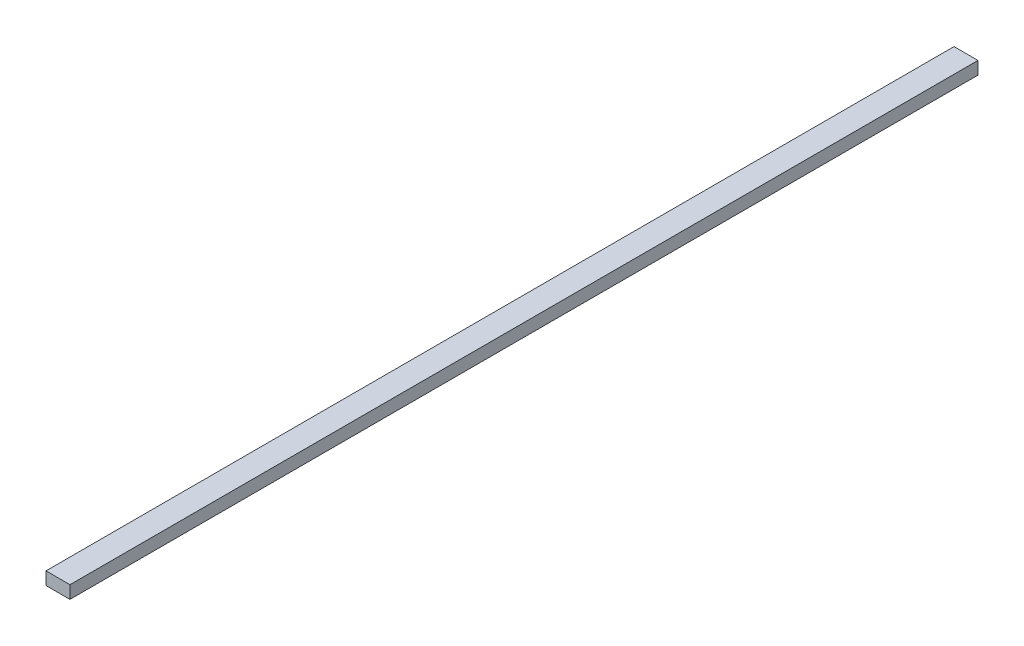
ISO-10303-21;
HEADER;
FILE_DESCRIPTION(('STEP AP214'),'2;1');
FILE_NAME('part.step','',(''),(''),'','','');
FILE_SCHEMA(('AUTOMOTIVE_DESIGN { 1 0 10303 214 1 1 1 1 }'));
ENDSEC;
DATA;
#1=APPLICATION_CONTEXT('core data for automotive mechanical design processes');
#2=APPLICATION_PROTOCOL_DEFINITION('international standard','automotive_design',2000,#1);
#3=PRODUCT_CONTEXT('',#1,'mechanical');
#4=PRODUCT('Part','Part','',(#3));
#5=PRODUCT_RELATED_PRODUCT_CATEGORY('part','',(#4));
#6=PRODUCT_DEFINITION_FORMATION('','',#4);
#7=PRODUCT_DEFINITION_CONTEXT('part definition',#1,'design');
#8=PRODUCT_DEFINITION('design','',#6,#7);
#9=PRODUCT_DEFINITION_SHAPE('','',#8);
#10=(LENGTH_UNIT() NAMED_UNIT(*) SI_UNIT(.MILLI.,.METRE.));
#11=(NAMED_UNIT(*) PLANE_ANGLE_UNIT() SI_UNIT($,.RADIAN.));
#12=(NAMED_UNIT(*) SI_UNIT($,.STERADIAN.) SOLID_ANGLE_UNIT());
#13=UNCERTAINTY_MEASURE_WITH_UNIT(LENGTH_MEASURE(1.E-05),#10,'distance_accuracy_value','');
#14=(GEOMETRIC_REPRESENTATION_CONTEXT(3) GLOBAL_UNCERTAINTY_ASSIGNED_CONTEXT((#13)) GLOBAL_UNIT_ASSIGNED_CONTEXT((#10,
#11,#12)) REPRESENTATION_CONTEXT('',''));
#15=CARTESIAN_POINT('',(0.,0.,0.));
#16=DIRECTION('',(0.,0.,1.));
#17=DIRECTION('',(1.,0.,0.));
#18=AXIS2_PLACEMENT_3D('',#15,#16,#17);
#19=CARTESIAN_POINT('',(-44.9531562575944,20.2474204131232,-234.95));
#20=DIRECTION('',(1.,0.,0.));
#21=DIRECTION('',(0.,0.,-1.));
#22=AXIS2_PLACEMENT_3D('',#19,#20,#21);
#23=PLANE('',#22);
#24=DIRECTION('',(0.,1.,0.));
#25=VECTOR('',#24,1.);
#26=CARTESIAN_POINT('',(-44.9531562575944,20.2474204131232,0.));
#27=LINE('',#26,#25);
#28=CARTESIAN_POINT('',(-44.9531562575944,20.2474204131232,0.));
#29=VERTEX_POINT('',#28);
#30=CARTESIAN_POINT('',(-44.9531562575944,23.5494204131232,0.));
#31=VERTEX_POINT('',#30);
#32=EDGE_CURVE('E83',#29,#31,#27,.T.);
#33=ORIENTED_EDGE('',*,*,#32,.F.);
#34=DIRECTION('',(0.,0.,1.));
#35=VECTOR('',#34,1.);
#36=CARTESIAN_POINT('',(-44.9531562575944,20.2474204131232,-234.95));
#37=LINE('',#36,#35);
#38=CARTESIAN_POINT('',(-44.9531562575944,20.2474204131232,-234.95));
#39=VERTEX_POINT('',#38);
#40=EDGE_CURVE('E32',#39,#29,#37,.T.);
#41=ORIENTED_EDGE('',*,*,#40,.F.);
#42=DIRECTION('',(0.,1.,0.));
#43=VECTOR('',#42,1.);
#44=CARTESIAN_POINT('',(-44.9531562575944,20.2474204131232,-234.95));
#45=LINE('',#44,#43);
#46=CARTESIAN_POINT('',(-44.9531562575944,23.5494204131232,-234.95));
#47=VERTEX_POINT('',#46);
#48=EDGE_CURVE('E71',#39,#47,#45,.T.);
#49=ORIENTED_EDGE('',*,*,#48,.T.);
#50=DIRECTION('',(0.,0.,1.));
#51=VECTOR('',#50,1.);
#52=CARTESIAN_POINT('',(-44.9531562575944,23.5494204131232,-234.95));
#53=LINE('',#52,#51);
#54=EDGE_CURVE('E10',#47,#31,#53,.T.);
#55=ORIENTED_EDGE('',*,*,#54,.T.);
#56=EDGE_LOOP('',(#33,#41,#49,#55));
#57=FACE_BOUND('',#56,.T.);
#58=ADVANCED_FACE('F16',(#57),#23,.T.);
#59=CARTESIAN_POINT('',(-44.9531562575944,23.5494204131232,-234.95));
#60=DIRECTION('',(0.,1.,0.));
#61=DIRECTION('',(0.,0.,1.));
#62=AXIS2_PLACEMENT_3D('',#59,#60,#61);
#63=PLANE('',#62);
#64=DIRECTION('',(-1.,0.,0.));
#65=VECTOR('',#64,1.);
#66=CARTESIAN_POINT('',(-44.9531562575944,23.5494204131232,0.));
#67=LINE('',#66,#65);
#68=CARTESIAN_POINT('',(-51.1507562575944,23.5494204131232,0.));
#69=VERTEX_POINT('',#68);
#70=EDGE_CURVE('E80',#31,#69,#67,.T.);
#71=ORIENTED_EDGE('',*,*,#70,.F.);
#72=ORIENTED_EDGE('',*,*,#54,.F.);
#73=DIRECTION('',(-1.,0.,0.));
#74=VECTOR('',#73,1.);
#75=CARTESIAN_POINT('',(-44.9531562575944,23.5494204131232,-234.95));
#76=LINE('',#75,#74);
#77=CARTESIAN_POINT('',(-51.1507562575944,23.5494204131232,-234.95));
#78=VERTEX_POINT('',#77);
#79=EDGE_CURVE('E67',#47,#78,#76,.T.);
#80=ORIENTED_EDGE('',*,*,#79,.T.);
#81=DIRECTION('',(0.,0.,1.));
#82=VECTOR('',#81,1.);
#83=CARTESIAN_POINT('',(-51.1507562575944,23.5494204131232,-234.95));
#84=LINE('',#83,#82);
#85=EDGE_CURVE('E24',#78,#69,#84,.T.);
#86=ORIENTED_EDGE('',*,*,#85,.T.);
#87=EDGE_LOOP('',(#71,#72,#80,#86));
#88=FACE_BOUND('',#87,.T.);
#89=ADVANCED_FACE('F68',(#88),#63,.T.);
#90=CARTESIAN_POINT('',(-51.1507562575944,23.5494204131232,-234.95));
#91=DIRECTION('',(-1.,0.,0.));
#92=DIRECTION('',(0.,0.,1.));
#93=AXIS2_PLACEMENT_3D('',#90,#91,#92);
#94=PLANE('',#93);
#95=DIRECTION('',(0.,-1.,0.));
#96=VECTOR('',#95,1.);
#97=CARTESIAN_POINT('',(-51.1507562575944,23.5494204131232,0.));
#98=LINE('',#97,#96);
#99=CARTESIAN_POINT('',(-51.1507562575944,20.2474204131232,0.));
#100=VERTEX_POINT('',#99);
#101=EDGE_CURVE('E65',#69,#100,#98,.T.);
#102=ORIENTED_EDGE('',*,*,#101,.F.);
#103=ORIENTED_EDGE('',*,*,#85,.F.);
#104=DIRECTION('',(0.,-1.,0.));
#105=VECTOR('',#104,1.);
#106=CARTESIAN_POINT('',(-51.1507562575944,23.5494204131232,-234.95));
#107=LINE('',#106,#105);
#108=CARTESIAN_POINT('',(-51.1507562575944,20.2474204131232,-234.95));
#109=VERTEX_POINT('',#108);
#110=EDGE_CURVE('E62',#78,#109,#107,.T.);
#111=ORIENTED_EDGE('',*,*,#110,.T.);
#112=DIRECTION('',(0.,0.,1.));
#113=VECTOR('',#112,1.);
#114=CARTESIAN_POINT('',(-51.1507562575944,20.2474204131232,-234.95));
#115=LINE('',#114,#113);
#116=EDGE_CURVE('E48',#109,#100,#115,.T.);
#117=ORIENTED_EDGE('',*,*,#116,.T.);
#118=EDGE_LOOP('',(#102,#103,#111,#117));
#119=FACE_BOUND('',#118,.T.);
#120=ADVANCED_FACE('F60',(#119),#94,.T.);
#121=CARTESIAN_POINT('',(-51.1507562575944,20.2474204131232,-234.95));
#122=DIRECTION('',(0.,-1.,0.));
#123=DIRECTION('',(0.,0.,-1.));
#124=AXIS2_PLACEMENT_3D('',#121,#122,#123);
#125=PLANE('',#124);
#126=DIRECTION('',(1.,0.,0.));
#127=VECTOR('',#126,1.);
#128=CARTESIAN_POINT('',(-51.1507562575944,20.2474204131232,0.));
#129=LINE('',#128,#127);
#130=EDGE_CURVE('E79',#100,#29,#129,.T.);
#131=ORIENTED_EDGE('',*,*,#130,.F.);
#132=ORIENTED_EDGE('',*,*,#116,.F.);
#133=DIRECTION('',(1.,0.,0.));
#134=VECTOR('',#133,1.);
#135=CARTESIAN_POINT('',(-51.1507562575944,20.2474204131232,-234.95));
#136=LINE('',#135,#134);
#137=EDGE_CURVE('E74',#109,#39,#136,.T.);
#138=ORIENTED_EDGE('',*,*,#137,.T.);
#139=ORIENTED_EDGE('',*,*,#40,.T.);
#140=EDGE_LOOP('',(#131,#132,#138,#139));
#141=FACE_BOUND('',#140,.T.);
#142=ADVANCED_FACE('F104',(#141),#125,.T.);
#143=CARTESIAN_POINT('',(0.,0.,-234.95));
#144=DIRECTION('',(0.,0.,1.));
#145=DIRECTION('',(1.,0.,0.));
#146=AXIS2_PLACEMENT_3D('',#143,#144,#145);
#147=PLANE('',#146);
#148=ORIENTED_EDGE('',*,*,#48,.F.);
#149=ORIENTED_EDGE('',*,*,#137,.F.);
#150=ORIENTED_EDGE('',*,*,#110,.F.);
#151=ORIENTED_EDGE('',*,*,#79,.F.);
#152=EDGE_LOOP('',(#148,#149,#150,#151));
#153=FACE_BOUND('',#152,.T.);
#154=ADVANCED_FACE('F73',(#153),#147,.F.);
#155=CARTESIAN_POINT('',(0.,0.,0.));
#156=DIRECTION('',(0.,0.,1.));
#157=DIRECTION('',(1.,0.,0.));
#158=AXIS2_PLACEMENT_3D('',#155,#156,#157);
#159=PLANE('',#158);
#160=ORIENTED_EDGE('',*,*,#32,.T.);
#161=ORIENTED_EDGE('',*,*,#70,.T.);
#162=ORIENTED_EDGE('',*,*,#101,.T.);
#163=ORIENTED_EDGE('',*,*,#130,.T.);
#164=EDGE_LOOP('',(#160,#161,#162,#163));
#165=FACE_BOUND('',#164,.T.);
#166=ADVANCED_FACE('F95',(#165),#159,.T.);
#167=CLOSED_SHELL('',(#58,#89,#120,#142,#154,#166));
#168=MANIFOLD_SOLID_BREP('B1',#167);
#169=ADVANCED_BREP_SHAPE_REPRESENTATION('',(#18,#168),#14);
#170=SHAPE_DEFINITION_REPRESENTATION(#9,#169);
ENDSEC;
END-ISO-10303-21;
